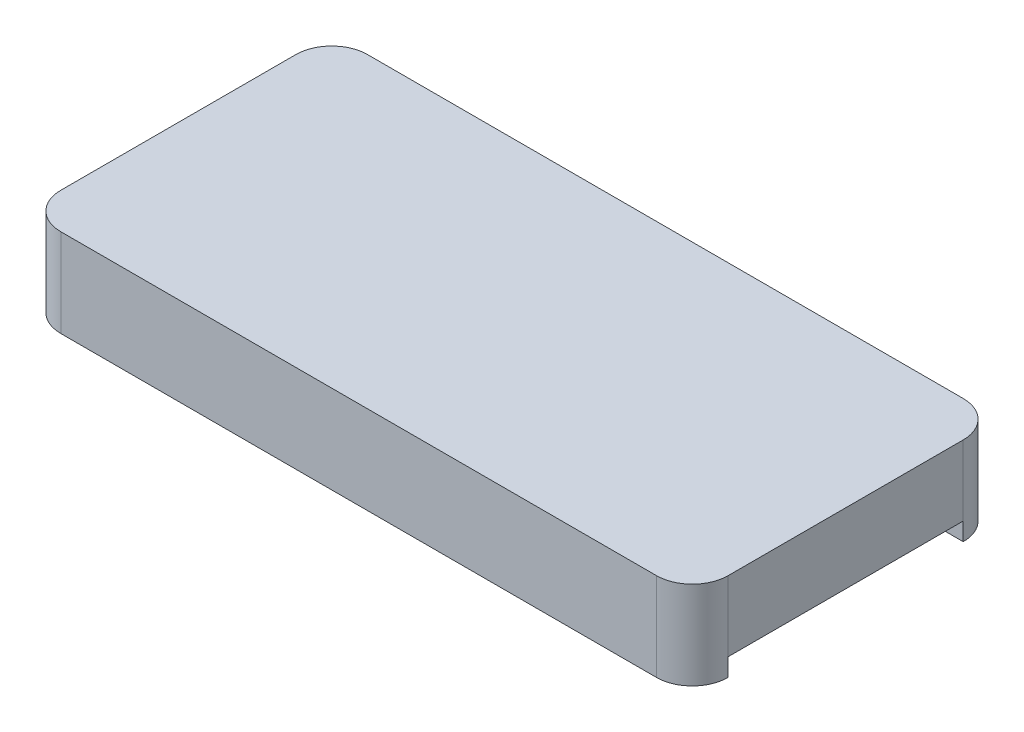
ISO-10303-21;
HEADER;
FILE_DESCRIPTION(('STEP AP214'),'2;1');
FILE_NAME('part.step','',(''),(''),'','','');
FILE_SCHEMA(('AUTOMOTIVE_DESIGN { 1 0 10303 214 1 1 1 1 }'));
ENDSEC;
DATA;
#1=APPLICATION_CONTEXT('core data for automotive mechanical design processes');
#2=APPLICATION_PROTOCOL_DEFINITION('international standard','automotive_design',2000,#1);
#3=PRODUCT_CONTEXT('',#1,'mechanical');
#4=PRODUCT('Part','Part','',(#3));
#5=PRODUCT_RELATED_PRODUCT_CATEGORY('part','',(#4));
#6=PRODUCT_DEFINITION_FORMATION('','',#4);
#7=PRODUCT_DEFINITION_CONTEXT('part definition',#1,'design');
#8=PRODUCT_DEFINITION('design','',#6,#7);
#9=PRODUCT_DEFINITION_SHAPE('','',#8);
#10=(LENGTH_UNIT() NAMED_UNIT(*) SI_UNIT(.MILLI.,.METRE.));
#11=(NAMED_UNIT(*) PLANE_ANGLE_UNIT() SI_UNIT($,.RADIAN.));
#12=(NAMED_UNIT(*) SI_UNIT($,.STERADIAN.) SOLID_ANGLE_UNIT());
#13=UNCERTAINTY_MEASURE_WITH_UNIT(LENGTH_MEASURE(1.E-05),#10,'distance_accuracy_value','');
#14=(GEOMETRIC_REPRESENTATION_CONTEXT(3) GLOBAL_UNCERTAINTY_ASSIGNED_CONTEXT((#13)) GLOBAL_UNIT_ASSIGNED_CONTEXT((#10,
#11,#12)) REPRESENTATION_CONTEXT('',''));
#15=CARTESIAN_POINT('',(0.,0.,0.));
#16=DIRECTION('',(0.,0.,1.));
#17=DIRECTION('',(1.,0.,0.));
#18=AXIS2_PLACEMENT_3D('',#15,#16,#17);
#19=CARTESIAN_POINT('',(0.,0.,0.));
#20=DIRECTION('',(0.,1.,0.));
#21=DIRECTION('',(0.,0.,1.));
#22=AXIS2_PLACEMENT_3D('',#19,#20,#21);
#23=PLANE('',#22);
#24=DIRECTION('',(1.,0.,0.));
#25=VECTOR('',#24,1.);
#26=CARTESIAN_POINT('',(-15.6,0.,-4.));
#27=LINE('',#26,#25);
#28=CARTESIAN_POINT('',(-18.6,0.,-4.));
#29=VERTEX_POINT('',#28);
#30=CARTESIAN_POINT('',(-15.6,0.,-4.));
#31=VERTEX_POINT('',#30);
#32=EDGE_CURVE('E255',#29,#31,#27,.T.);
#33=ORIENTED_EDGE('',*,*,#32,.F.);
#34=DIRECTION('',(0.,0.,1.));
#35=VECTOR('',#34,1.);
#36=CARTESIAN_POINT('',(-18.6,0.,8.55));
#37=LINE('',#36,#35);
#38=CARTESIAN_POINT('',(-18.6,0.,-6.55));
#39=VERTEX_POINT('',#38);
#40=EDGE_CURVE('E250',#39,#29,#37,.T.);
#41=ORIENTED_EDGE('',*,*,#40,.F.);
#42=CARTESIAN_POINT('',(-16.6,0.,-6.55));
#43=DIRECTION('',(0.,1.,0.));
#44=DIRECTION('',(0.,0.,1.));
#45=AXIS2_PLACEMENT_3D('',#42,#43,#44);
#46=CIRCLE('',#45,2.);
#47=CARTESIAN_POINT('',(-16.6,0.,-8.55));
#48=VERTEX_POINT('',#47);
#49=EDGE_CURVE('E11',#39,#48,#46,.F.);
#50=ORIENTED_EDGE('',*,*,#49,.T.);
#51=DIRECTION('',(-1.,0.,0.));
#52=VECTOR('',#51,1.);
#53=CARTESIAN_POINT('',(-18.6,0.,-8.55));
#54=LINE('',#53,#52);
#55=CARTESIAN_POINT('',(16.6,0.,-8.55));
#56=VERTEX_POINT('',#55);
#57=EDGE_CURVE('E49',#56,#48,#54,.T.);
#58=ORIENTED_EDGE('',*,*,#57,.F.);
#59=CARTESIAN_POINT('',(16.6,0.,-6.55));
#60=DIRECTION('',(0.,1.,0.));
#61=DIRECTION('',(0.,0.,1.));
#62=AXIS2_PLACEMENT_3D('',#59,#60,#61);
#63=CIRCLE('',#62,2.);
#64=CARTESIAN_POINT('',(18.6,0.,-6.55));
#65=VERTEX_POINT('',#64);
#66=EDGE_CURVE('E41',#56,#65,#63,.F.);
#67=ORIENTED_EDGE('',*,*,#66,.T.);
#68=DIRECTION('',(1.,0.,0.));
#69=VECTOR('',#68,1.);
#70=CARTESIAN_POINT('',(15.6,0.,-6.55));
#71=LINE('',#70,#69);
#72=CARTESIAN_POINT('',(15.6,0.,-6.55));
#73=VERTEX_POINT('',#72);
#74=EDGE_CURVE('E238',#73,#65,#71,.T.);
#75=ORIENTED_EDGE('',*,*,#74,.F.);
#76=DIRECTION('',(0.,0.,-1.));
#77=VECTOR('',#76,1.);
#78=CARTESIAN_POINT('',(15.6,0.,0.));
#79=LINE('',#78,#77);
#80=CARTESIAN_POINT('',(15.6,0.,6.55));
#81=VERTEX_POINT('',#80);
#82=EDGE_CURVE('E148',#81,#73,#79,.T.);
#83=ORIENTED_EDGE('',*,*,#82,.F.);
#84=DIRECTION('',(-1.,0.,0.));
#85=VECTOR('',#84,1.);
#86=CARTESIAN_POINT('',(15.6,0.,6.55));
#87=LINE('',#86,#85);
#88=CARTESIAN_POINT('',(18.6,0.,6.55));
#89=VERTEX_POINT('',#88);
#90=EDGE_CURVE('E236',#89,#81,#87,.T.);
#91=ORIENTED_EDGE('',*,*,#90,.F.);
#92=CARTESIAN_POINT('',(16.6,0.,6.55));
#93=DIRECTION('',(0.,1.,0.));
#94=DIRECTION('',(0.,0.,1.));
#95=AXIS2_PLACEMENT_3D('',#92,#93,#94);
#96=CIRCLE('',#95,2.);
#97=CARTESIAN_POINT('',(16.6,0.,8.55));
#98=VERTEX_POINT('',#97);
#99=EDGE_CURVE('E243',#89,#98,#96,.F.);
#100=ORIENTED_EDGE('',*,*,#99,.T.);
#101=DIRECTION('',(1.,0.,0.));
#102=VECTOR('',#101,1.);
#103=CARTESIAN_POINT('',(-18.6,0.,8.55));
#104=LINE('',#103,#102);
#105=CARTESIAN_POINT('',(-16.6,0.,8.55));
#106=VERTEX_POINT('',#105);
#107=EDGE_CURVE('E246',#106,#98,#104,.T.);
#108=ORIENTED_EDGE('',*,*,#107,.F.);
#109=CARTESIAN_POINT('',(-16.6,0.,6.55));
#110=DIRECTION('',(0.,1.,0.));
#111=DIRECTION('',(0.,0.,1.));
#112=AXIS2_PLACEMENT_3D('',#109,#110,#111);
#113=CIRCLE('',#112,2.);
#114=CARTESIAN_POINT('',(-18.6,0.,6.55));
#115=VERTEX_POINT('',#114);
#116=EDGE_CURVE('E242',#106,#115,#113,.F.);
#117=ORIENTED_EDGE('',*,*,#116,.T.);
#118=CARTESIAN_POINT('',(-18.6,0.,4.));
#119=VERTEX_POINT('',#118);
#120=EDGE_CURVE('E248',#119,#115,#37,.T.);
#121=ORIENTED_EDGE('',*,*,#120,.F.);
#122=DIRECTION('',(-1.,0.,0.));
#123=VECTOR('',#122,1.);
#124=CARTESIAN_POINT('',(-15.6,0.,4.));
#125=LINE('',#124,#123);
#126=CARTESIAN_POINT('',(-15.6,0.,4.));
#127=VERTEX_POINT('',#126);
#128=EDGE_CURVE('E249',#127,#119,#125,.T.);
#129=ORIENTED_EDGE('',*,*,#128,.F.);
#130=DIRECTION('',(0.,0.,1.));
#131=VECTOR('',#130,1.);
#132=CARTESIAN_POINT('',(-15.6,0.,0.));
#133=LINE('',#132,#131);
#134=EDGE_CURVE('E36',#31,#127,#133,.T.);
#135=ORIENTED_EDGE('',*,*,#134,.F.);
#136=EDGE_LOOP('',(#33,#41,#50,#58,#67,#75,#83,#91,#100,#108,#117,#121,#129,#135));
#137=FACE_BOUND('',#136,.T.);
#138=ADVANCED_FACE('F33',(#137),#23,.F.);
#139=CARTESIAN_POINT('',(18.6,4.915,8.55));
#140=DIRECTION('',(-1.,0.,0.));
#141=DIRECTION('',(0.,0.,1.));
#142=AXIS2_PLACEMENT_3D('',#139,#140,#141);
#143=PLANE('',#142);
#144=DIRECTION('',(0.,-1.,0.));
#145=VECTOR('',#144,1.);
#146=CARTESIAN_POINT('',(18.6,4.915,6.55));
#147=LINE('',#146,#145);
#148=CARTESIAN_POINT('',(18.6,4.915,6.55));
#149=VERTEX_POINT('',#148);
#150=CARTESIAN_POINT('',(18.6,1.,6.55));
#151=VERTEX_POINT('',#150);
#152=EDGE_CURVE('E210',#149,#151,#147,.T.);
#153=ORIENTED_EDGE('',*,*,#152,.T.);
#154=DIRECTION('',(0.,0.,1.));
#155=VECTOR('',#154,1.);
#156=CARTESIAN_POINT('',(18.6,1.,6.55));
#157=LINE('',#156,#155);
#158=CARTESIAN_POINT('',(18.6,1.,-6.55));
#159=VERTEX_POINT('',#158);
#160=EDGE_CURVE('E170',#159,#151,#157,.T.);
#161=ORIENTED_EDGE('',*,*,#160,.F.);
#162=DIRECTION('',(0.,-1.,0.));
#163=VECTOR('',#162,1.);
#164=CARTESIAN_POINT('',(18.6,4.915,-6.55));
#165=LINE('',#164,#163);
#166=CARTESIAN_POINT('',(18.6,4.915,-6.55));
#167=VERTEX_POINT('',#166);
#168=EDGE_CURVE('E208',#159,#167,#165,.F.);
#169=ORIENTED_EDGE('',*,*,#168,.T.);
#170=DIRECTION('',(0.,0.,-1.));
#171=VECTOR('',#170,1.);
#172=CARTESIAN_POINT('',(18.6,4.915,8.55));
#173=LINE('',#172,#171);
#174=EDGE_CURVE('E194',#149,#167,#173,.T.);
#175=ORIENTED_EDGE('',*,*,#174,.F.);
#176=EDGE_LOOP('',(#153,#161,#169,#175));
#177=FACE_BOUND('',#176,.T.);
#178=ADVANCED_FACE('F291',(#177),#143,.F.);
#179=CARTESIAN_POINT('',(-18.6,4.915,-8.55));
#180=DIRECTION('',(0.,0.,1.));
#181=DIRECTION('',(1.,0.,0.));
#182=AXIS2_PLACEMENT_3D('',#179,#180,#181);
#183=PLANE('',#182);
#184=DIRECTION('',(0.,-1.,0.));
#185=VECTOR('',#184,1.);
#186=CARTESIAN_POINT('',(16.6,4.915,-8.55));
#187=LINE('',#186,#185);
#188=CARTESIAN_POINT('',(16.6,4.915,-8.55));
#189=VERTEX_POINT('',#188);
#190=EDGE_CURVE('E233',#189,#56,#187,.T.);
#191=ORIENTED_EDGE('',*,*,#190,.T.);
#192=ORIENTED_EDGE('',*,*,#57,.T.);
#193=DIRECTION('',(0.,-1.,0.));
#194=VECTOR('',#193,1.);
#195=CARTESIAN_POINT('',(-16.6,4.915,-8.55));
#196=LINE('',#195,#194);
#197=CARTESIAN_POINT('',(-16.6,4.915,-8.55));
#198=VERTEX_POINT('',#197);
#199=EDGE_CURVE('E231',#48,#198,#196,.F.);
#200=ORIENTED_EDGE('',*,*,#199,.T.);
#201=DIRECTION('',(-1.,0.,0.));
#202=VECTOR('',#201,1.);
#203=CARTESIAN_POINT('',(-18.6,4.915,-8.55));
#204=LINE('',#203,#202);
#205=EDGE_CURVE('E199',#189,#198,#204,.T.);
#206=ORIENTED_EDGE('',*,*,#205,.F.);
#207=EDGE_LOOP('',(#191,#192,#200,#206));
#208=FACE_BOUND('',#207,.T.);
#209=ADVANCED_FACE('F296',(#208),#183,.F.);
#210=CARTESIAN_POINT('',(0.,4.915,0.));
#211=DIRECTION('',(0.,-1.,0.));
#212=DIRECTION('',(0.,0.,-1.));
#213=AXIS2_PLACEMENT_3D('',#210,#211,#212);
#214=PLANE('',#213);
#215=DIRECTION('',(1.,0.,0.));
#216=VECTOR('',#215,1.);
#217=CARTESIAN_POINT('',(-18.6,4.915,8.55));
#218=LINE('',#217,#216);
#219=CARTESIAN_POINT('',(-16.6,4.915,8.55));
#220=VERTEX_POINT('',#219);
#221=CARTESIAN_POINT('',(16.6,4.915,8.55));
#222=VERTEX_POINT('',#221);
#223=EDGE_CURVE('E205',#220,#222,#218,.T.);
#224=ORIENTED_EDGE('',*,*,#223,.T.);
#225=CARTESIAN_POINT('',(16.6,4.915,6.55));
#226=DIRECTION('',(0.,-1.,0.));
#227=DIRECTION('',(0.,0.,-1.));
#228=AXIS2_PLACEMENT_3D('',#225,#226,#227);
#229=CIRCLE('',#228,2.);
#230=EDGE_CURVE('E224',#222,#149,#229,.F.);
#231=ORIENTED_EDGE('',*,*,#230,.T.);
#232=ORIENTED_EDGE('',*,*,#174,.T.);
#233=CARTESIAN_POINT('',(16.6,4.915,-6.55));
#234=DIRECTION('',(0.,-1.,0.));
#235=DIRECTION('',(0.,0.,-1.));
#236=AXIS2_PLACEMENT_3D('',#233,#234,#235);
#237=CIRCLE('',#236,2.);
#238=EDGE_CURVE('E220',#167,#189,#237,.F.);
#239=ORIENTED_EDGE('',*,*,#238,.T.);
#240=ORIENTED_EDGE('',*,*,#205,.T.);
#241=CARTESIAN_POINT('',(-16.6,4.915,-6.55));
#242=DIRECTION('',(0.,-1.,0.));
#243=DIRECTION('',(0.,0.,-1.));
#244=AXIS2_PLACEMENT_3D('',#241,#242,#243);
#245=CIRCLE('',#244,2.);
#246=CARTESIAN_POINT('',(-18.6,4.915,-6.55));
#247=VERTEX_POINT('',#246);
#248=EDGE_CURVE('E218',#198,#247,#245,.F.);
#249=ORIENTED_EDGE('',*,*,#248,.T.);
#250=DIRECTION('',(0.,0.,1.));
#251=VECTOR('',#250,1.);
#252=CARTESIAN_POINT('',(-18.6,4.915,8.55));
#253=LINE('',#252,#251);
#254=CARTESIAN_POINT('',(-18.6,4.915,6.55));
#255=VERTEX_POINT('',#254);
#256=EDGE_CURVE('E202',#247,#255,#253,.T.);
#257=ORIENTED_EDGE('',*,*,#256,.T.);
#258=CARTESIAN_POINT('',(-16.6,4.915,6.55));
#259=DIRECTION('',(0.,-1.,0.));
#260=DIRECTION('',(0.,0.,-1.));
#261=AXIS2_PLACEMENT_3D('',#258,#259,#260);
#262=CIRCLE('',#261,2.);
#263=EDGE_CURVE('E222',#255,#220,#262,.F.);
#264=ORIENTED_EDGE('',*,*,#263,.T.);
#265=EDGE_LOOP('',(#224,#231,#232,#239,#240,#249,#257,#264));
#266=FACE_BOUND('',#265,.T.);
#267=ADVANCED_FACE('F383',(#266),#214,.F.);
#268=CARTESIAN_POINT('',(-18.6,4.915,8.55));
#269=DIRECTION('',(1.,0.,0.));
#270=DIRECTION('',(0.,0.,-1.));
#271=AXIS2_PLACEMENT_3D('',#268,#269,#270);
#272=PLANE('',#271);
#273=DIRECTION('',(0.,-1.,0.));
#274=VECTOR('',#273,1.);
#275=CARTESIAN_POINT('',(-18.6,4.915,-6.55));
#276=LINE('',#275,#274);
#277=EDGE_CURVE('E226',#247,#39,#276,.T.);
#278=ORIENTED_EDGE('',*,*,#277,.T.);
#279=ORIENTED_EDGE('',*,*,#40,.T.);
#280=DIRECTION('',(0.,-1.,0.));
#281=VECTOR('',#280,1.);
#282=CARTESIAN_POINT('',(-18.6,-1.5,-4.));
#283=LINE('',#282,#281);
#284=CARTESIAN_POINT('',(-18.6,1.5,-4.));
#285=VERTEX_POINT('',#284);
#286=EDGE_CURVE('E179',#285,#29,#283,.T.);
#287=ORIENTED_EDGE('',*,*,#286,.F.);
#288=DIRECTION('',(0.,0.,-1.));
#289=VECTOR('',#288,1.);
#290=CARTESIAN_POINT('',(-18.6,1.5,-4.));
#291=LINE('',#290,#289);
#292=CARTESIAN_POINT('',(-18.6,1.5,4.));
#293=VERTEX_POINT('',#292);
#294=EDGE_CURVE('E187',#293,#285,#291,.T.);
#295=ORIENTED_EDGE('',*,*,#294,.F.);
#296=DIRECTION('',(0.,1.,0.));
#297=VECTOR('',#296,1.);
#298=CARTESIAN_POINT('',(-18.6,-1.5,4.));
#299=LINE('',#298,#297);
#300=EDGE_CURVE('E174',#119,#293,#299,.T.);
#301=ORIENTED_EDGE('',*,*,#300,.F.);
#302=ORIENTED_EDGE('',*,*,#120,.T.);
#303=DIRECTION('',(0.,-1.,0.));
#304=VECTOR('',#303,1.);
#305=CARTESIAN_POINT('',(-18.6,4.915,6.55));
#306=LINE('',#305,#304);
#307=EDGE_CURVE('E229',#115,#255,#306,.F.);
#308=ORIENTED_EDGE('',*,*,#307,.T.);
#309=ORIENTED_EDGE('',*,*,#256,.F.);
#310=EDGE_LOOP('',(#278,#279,#287,#295,#301,#302,#308,#309));
#311=FACE_BOUND('',#310,.T.);
#312=ADVANCED_FACE('F270',(#311),#272,.F.);
#313=CARTESIAN_POINT('',(-15.6,1.5,-4.));
#314=DIRECTION('',(0.,1.,0.));
#315=DIRECTION('',(0.,0.,1.));
#316=AXIS2_PLACEMENT_3D('',#313,#314,#315);
#317=PLANE('',#316);
#318=ORIENTED_EDGE('',*,*,#294,.T.);
#319=DIRECTION('',(-1.,0.,0.));
#320=VECTOR('',#319,1.);
#321=CARTESIAN_POINT('',(-15.6,1.5,-4.));
#322=LINE('',#321,#320);
#323=CARTESIAN_POINT('',(-15.6,1.5,-4.));
#324=VERTEX_POINT('',#323);
#325=EDGE_CURVE('E192',#324,#285,#322,.T.);
#326=ORIENTED_EDGE('',*,*,#325,.F.);
#327=DIRECTION('',(0.,0.,-1.));
#328=VECTOR('',#327,1.);
#329=CARTESIAN_POINT('',(-15.6,1.5,-4.));
#330=LINE('',#329,#328);
#331=CARTESIAN_POINT('',(-15.6,1.5,4.));
#332=VERTEX_POINT('',#331);
#333=EDGE_CURVE('E178',#332,#324,#330,.T.);
#334=ORIENTED_EDGE('',*,*,#333,.F.);
#335=DIRECTION('',(-1.,0.,0.));
#336=VECTOR('',#335,1.);
#337=CARTESIAN_POINT('',(-15.6,1.5,4.));
#338=LINE('',#337,#336);
#339=EDGE_CURVE('E185',#332,#293,#338,.T.);
#340=ORIENTED_EDGE('',*,*,#339,.T.);
#341=EDGE_LOOP('',(#318,#326,#334,#340));
#342=FACE_BOUND('',#341,.T.);
#343=ADVANCED_FACE('F273',(#342),#317,.F.);
#344=CARTESIAN_POINT('',(-15.6,-1.5,4.));
#345=DIRECTION('',(0.,0.,1.));
#346=DIRECTION('',(1.,0.,0.));
#347=AXIS2_PLACEMENT_3D('',#344,#345,#346);
#348=PLANE('',#347);
#349=DIRECTION('',(0.,1.,0.));
#350=VECTOR('',#349,1.);
#351=CARTESIAN_POINT('',(-15.6,-1.5,4.));
#352=LINE('',#351,#350);
#353=EDGE_CURVE('E176',#127,#332,#352,.T.);
#354=ORIENTED_EDGE('',*,*,#353,.F.);
#355=ORIENTED_EDGE('',*,*,#128,.T.);
#356=ORIENTED_EDGE('',*,*,#300,.T.);
#357=ORIENTED_EDGE('',*,*,#339,.F.);
#358=EDGE_LOOP('',(#354,#355,#356,#357));
#359=FACE_BOUND('',#358,.T.);
#360=ADVANCED_FACE('F261',(#359),#348,.F.);
#361=CARTESIAN_POINT('',(-15.6,-1.5,-4.));
#362=DIRECTION('',(0.,0.,-1.));
#363=DIRECTION('',(-1.,0.,0.));
#364=AXIS2_PLACEMENT_3D('',#361,#362,#363);
#365=PLANE('',#364);
#366=ORIENTED_EDGE('',*,*,#286,.T.);
#367=ORIENTED_EDGE('',*,*,#32,.T.);
#368=DIRECTION('',(0.,-1.,0.));
#369=VECTOR('',#368,1.);
#370=CARTESIAN_POINT('',(-15.6,-1.5,-4.));
#371=LINE('',#370,#369);
#372=EDGE_CURVE('E182',#324,#31,#371,.T.);
#373=ORIENTED_EDGE('',*,*,#372,.F.);
#374=ORIENTED_EDGE('',*,*,#325,.T.);
#375=EDGE_LOOP('',(#366,#367,#373,#374));
#376=FACE_BOUND('',#375,.T.);
#377=ADVANCED_FACE('F279',(#376),#365,.F.);
#378=CARTESIAN_POINT('',(-15.6,0.,0.));
#379=DIRECTION('',(1.,0.,0.));
#380=DIRECTION('',(0.,0.,-1.));
#381=AXIS2_PLACEMENT_3D('',#378,#379,#380);
#382=PLANE('',#381);
#383=ORIENTED_EDGE('',*,*,#372,.T.);
#384=ORIENTED_EDGE('',*,*,#134,.T.);
#385=ORIENTED_EDGE('',*,*,#353,.T.);
#386=ORIENTED_EDGE('',*,*,#333,.T.);
#387=EDGE_LOOP('',(#383,#384,#385,#386));
#388=FACE_BOUND('',#387,.T.);
#389=ADVANCED_FACE('F277',(#388),#382,.F.);
#390=CARTESIAN_POINT('',(-16.6,4.915,-6.55));
#391=DIRECTION('',(0.,-1.,0.));
#392=DIRECTION('',(0.,0.,-1.));
#393=AXIS2_PLACEMENT_3D('',#390,#391,#392);
#394=CYLINDRICAL_SURFACE('',#393,2.);
#395=ORIENTED_EDGE('',*,*,#49,.F.);
#396=ORIENTED_EDGE('',*,*,#277,.F.);
#397=ORIENTED_EDGE('',*,*,#248,.F.);
#398=ORIENTED_EDGE('',*,*,#199,.F.);
#399=EDGE_LOOP('',(#395,#396,#397,#398));
#400=FACE_BOUND('',#399,.T.);
#401=ADVANCED_FACE('F286',(#400),#394,.T.);
#402=CARTESIAN_POINT('',(16.6,4.915,-6.55));
#403=DIRECTION('',(0.,-1.,0.));
#404=DIRECTION('',(0.,0.,-1.));
#405=AXIS2_PLACEMENT_3D('',#402,#403,#404);
#406=CYLINDRICAL_SURFACE('',#405,2.);
#407=ORIENTED_EDGE('',*,*,#66,.F.);
#408=ORIENTED_EDGE('',*,*,#190,.F.);
#409=ORIENTED_EDGE('',*,*,#238,.F.);
#410=ORIENTED_EDGE('',*,*,#168,.F.);
#411=DIRECTION('',(0.,1.,0.));
#412=VECTOR('',#411,1.);
#413=CARTESIAN_POINT('',(18.6,-1.,-6.55));
#414=LINE('',#413,#412);
#415=EDGE_CURVE('E157',#65,#159,#414,.T.);
#416=ORIENTED_EDGE('',*,*,#415,.F.);
#417=EDGE_LOOP('',(#407,#408,#409,#410,#416));
#418=FACE_BOUND('',#417,.T.);
#419=ADVANCED_FACE('F311',(#418),#406,.T.);
#420=CARTESIAN_POINT('',(16.6,4.915,6.55));
#421=DIRECTION('',(0.,-1.,0.));
#422=DIRECTION('',(0.,0.,-1.));
#423=AXIS2_PLACEMENT_3D('',#420,#421,#422);
#424=CYLINDRICAL_SURFACE('',#423,2.);
#425=ORIENTED_EDGE('',*,*,#99,.F.);
#426=DIRECTION('',(0.,-1.,0.));
#427=VECTOR('',#426,1.);
#428=CARTESIAN_POINT('',(18.6,-1.,6.55));
#429=LINE('',#428,#427);
#430=EDGE_CURVE('E151',#151,#89,#429,.T.);
#431=ORIENTED_EDGE('',*,*,#430,.F.);
#432=ORIENTED_EDGE('',*,*,#152,.F.);
#433=ORIENTED_EDGE('',*,*,#230,.F.);
#434=DIRECTION('',(0.,-1.,0.));
#435=VECTOR('',#434,1.);
#436=CARTESIAN_POINT('',(16.6,4.915,8.55));
#437=LINE('',#436,#435);
#438=EDGE_CURVE('E216',#98,#222,#437,.F.);
#439=ORIENTED_EDGE('',*,*,#438,.F.);
#440=EDGE_LOOP('',(#425,#431,#432,#433,#439));
#441=FACE_BOUND('',#440,.T.);
#442=ADVANCED_FACE('F310',(#441),#424,.T.);
#443=CARTESIAN_POINT('',(15.6,1.,6.55));
#444=DIRECTION('',(0.,1.,0.));
#445=DIRECTION('',(0.,0.,1.));
#446=AXIS2_PLACEMENT_3D('',#443,#444,#445);
#447=PLANE('',#446);
#448=ORIENTED_EDGE('',*,*,#160,.T.);
#449=DIRECTION('',(1.,0.,0.));
#450=VECTOR('',#449,1.);
#451=CARTESIAN_POINT('',(15.6,1.,6.55));
#452=LINE('',#451,#450);
#453=CARTESIAN_POINT('',(15.6,1.,6.55));
#454=VERTEX_POINT('',#453);
#455=EDGE_CURVE('E161',#454,#151,#452,.T.);
#456=ORIENTED_EDGE('',*,*,#455,.F.);
#457=DIRECTION('',(0.,0.,1.));
#458=VECTOR('',#457,1.);
#459=CARTESIAN_POINT('',(15.6,1.,6.55));
#460=LINE('',#459,#458);
#461=CARTESIAN_POINT('',(15.6,1.,-6.55));
#462=VERTEX_POINT('',#461);
#463=EDGE_CURVE('E146',#462,#454,#460,.T.);
#464=ORIENTED_EDGE('',*,*,#463,.F.);
#465=DIRECTION('',(1.,0.,0.));
#466=VECTOR('',#465,1.);
#467=CARTESIAN_POINT('',(15.6,1.,-6.55));
#468=LINE('',#467,#466);
#469=EDGE_CURVE('E154',#462,#159,#468,.T.);
#470=ORIENTED_EDGE('',*,*,#469,.T.);
#471=EDGE_LOOP('',(#448,#456,#464,#470));
#472=FACE_BOUND('',#471,.T.);
#473=ADVANCED_FACE('F164',(#472),#447,.F.);
#474=CARTESIAN_POINT('',(15.6,-1.,-6.55));
#475=DIRECTION('',(0.,0.,-1.));
#476=DIRECTION('',(-1.,0.,0.));
#477=AXIS2_PLACEMENT_3D('',#474,#475,#476);
#478=PLANE('',#477);
#479=DIRECTION('',(0.,1.,0.));
#480=VECTOR('',#479,1.);
#481=CARTESIAN_POINT('',(15.6,-1.,-6.55));
#482=LINE('',#481,#480);
#483=EDGE_CURVE('E141',#73,#462,#482,.T.);
#484=ORIENTED_EDGE('',*,*,#483,.F.);
#485=ORIENTED_EDGE('',*,*,#74,.T.);
#486=ORIENTED_EDGE('',*,*,#415,.T.);
#487=ORIENTED_EDGE('',*,*,#469,.F.);
#488=EDGE_LOOP('',(#484,#485,#486,#487));
#489=FACE_BOUND('',#488,.T.);
#490=ADVANCED_FACE('F155',(#489),#478,.F.);
#491=CARTESIAN_POINT('',(15.6,-1.,6.55));
#492=DIRECTION('',(0.,0.,1.));
#493=DIRECTION('',(1.,0.,0.));
#494=AXIS2_PLACEMENT_3D('',#491,#492,#493);
#495=PLANE('',#494);
#496=ORIENTED_EDGE('',*,*,#430,.T.);
#497=ORIENTED_EDGE('',*,*,#90,.T.);
#498=DIRECTION('',(0.,-1.,0.));
#499=VECTOR('',#498,1.);
#500=CARTESIAN_POINT('',(15.6,-1.,6.55));
#501=LINE('',#500,#499);
#502=EDGE_CURVE('E162',#454,#81,#501,.T.);
#503=ORIENTED_EDGE('',*,*,#502,.F.);
#504=ORIENTED_EDGE('',*,*,#455,.T.);
#505=EDGE_LOOP('',(#496,#497,#503,#504));
#506=FACE_BOUND('',#505,.T.);
#507=ADVANCED_FACE('F343',(#506),#495,.F.);
#508=CARTESIAN_POINT('',(15.6,0.,0.));
#509=DIRECTION('',(-1.,0.,0.));
#510=DIRECTION('',(0.,0.,1.));
#511=AXIS2_PLACEMENT_3D('',#508,#509,#510);
#512=PLANE('',#511);
#513=ORIENTED_EDGE('',*,*,#502,.T.);
#514=ORIENTED_EDGE('',*,*,#82,.T.);
#515=ORIENTED_EDGE('',*,*,#483,.T.);
#516=ORIENTED_EDGE('',*,*,#463,.T.);
#517=EDGE_LOOP('',(#513,#514,#515,#516));
#518=FACE_BOUND('',#517,.T.);
#519=ADVANCED_FACE('F144',(#518),#512,.F.);
#520=CARTESIAN_POINT('',(-18.6,4.915,8.55));
#521=DIRECTION('',(0.,0.,-1.));
#522=DIRECTION('',(-1.,0.,0.));
#523=AXIS2_PLACEMENT_3D('',#520,#521,#522);
#524=PLANE('',#523);
#525=DIRECTION('',(0.,-1.,0.));
#526=VECTOR('',#525,1.);
#527=CARTESIAN_POINT('',(-16.6,4.915,8.55));
#528=LINE('',#527,#526);
#529=EDGE_CURVE('E213',#220,#106,#528,.T.);
#530=ORIENTED_EDGE('',*,*,#529,.T.);
#531=ORIENTED_EDGE('',*,*,#107,.T.);
#532=ORIENTED_EDGE('',*,*,#438,.T.);
#533=ORIENTED_EDGE('',*,*,#223,.F.);
#534=EDGE_LOOP('',(#530,#531,#532,#533));
#535=FACE_BOUND('',#534,.T.);
#536=ADVANCED_FACE('F300',(#535),#524,.F.);
#537=CARTESIAN_POINT('',(-16.6,4.915,6.55));
#538=DIRECTION('',(0.,-1.,0.));
#539=DIRECTION('',(0.,0.,-1.));
#540=AXIS2_PLACEMENT_3D('',#537,#538,#539);
#541=CYLINDRICAL_SURFACE('',#540,2.);
#542=ORIENTED_EDGE('',*,*,#116,.F.);
#543=ORIENTED_EDGE('',*,*,#529,.F.);
#544=ORIENTED_EDGE('',*,*,#263,.F.);
#545=ORIENTED_EDGE('',*,*,#307,.F.);
#546=EDGE_LOOP('',(#542,#543,#544,#545));
#547=FACE_BOUND('',#546,.T.);
#548=ADVANCED_FACE('F292',(#547),#541,.T.);
#549=CLOSED_SHELL('',(#138,#178,#209,#267,#312,#343,#360,#377,#389,#401,#419,#442,#473,#490,
#507,#519,#536,#548));
#550=MANIFOLD_SOLID_BREP('B2',#549);
#551=ADVANCED_BREP_SHAPE_REPRESENTATION('',(#18,#550),#14);
#552=SHAPE_DEFINITION_REPRESENTATION(#9,#551);
ENDSEC;
END-ISO-10303-21;
